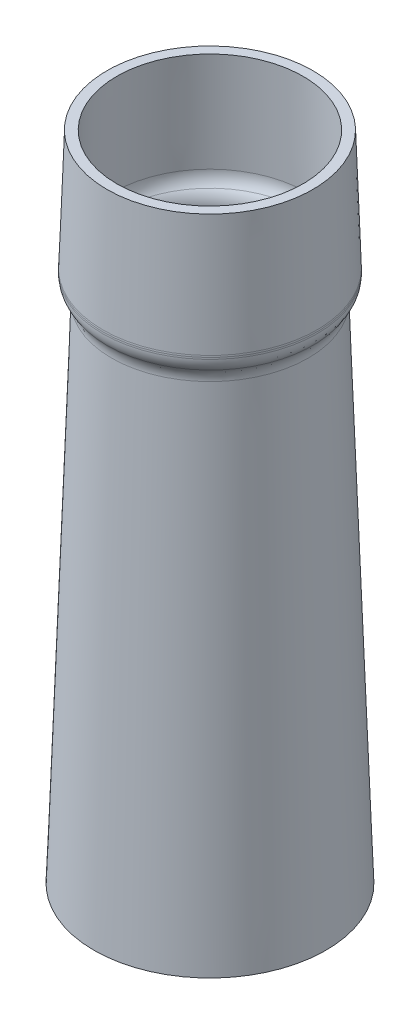
ISO-10303-21;
HEADER;
FILE_DESCRIPTION(('STEP AP214'),'2;1');
FILE_NAME('part.step','',(''),(''),'','','');
FILE_SCHEMA(('AUTOMOTIVE_DESIGN { 1 0 10303 214 1 1 1 1 }'));
ENDSEC;
DATA;
#1=APPLICATION_CONTEXT('core data for automotive mechanical design processes');
#2=APPLICATION_PROTOCOL_DEFINITION('international standard','automotive_design',2000,#1);
#3=PRODUCT_CONTEXT('',#1,'mechanical');
#4=PRODUCT('Part','Part','',(#3));
#5=PRODUCT_RELATED_PRODUCT_CATEGORY('part','',(#4));
#6=PRODUCT_DEFINITION_FORMATION('','',#4);
#7=PRODUCT_DEFINITION_CONTEXT('part definition',#1,'design');
#8=PRODUCT_DEFINITION('design','',#6,#7);
#9=PRODUCT_DEFINITION_SHAPE('','',#8);
#10=(LENGTH_UNIT() NAMED_UNIT(*) SI_UNIT(.MILLI.,.METRE.));
#11=(NAMED_UNIT(*) PLANE_ANGLE_UNIT() SI_UNIT($,.RADIAN.));
#12=(NAMED_UNIT(*) SI_UNIT($,.STERADIAN.) SOLID_ANGLE_UNIT());
#13=UNCERTAINTY_MEASURE_WITH_UNIT(LENGTH_MEASURE(1.E-05),#10,'distance_accuracy_value','');
#14=(GEOMETRIC_REPRESENTATION_CONTEXT(3) GLOBAL_UNCERTAINTY_ASSIGNED_CONTEXT((#13)) GLOBAL_UNIT_ASSIGNED_CONTEXT((#10,
#11,#12)) REPRESENTATION_CONTEXT('',''));
#15=CARTESIAN_POINT('',(0.,0.,0.));
#16=DIRECTION('',(0.,0.,1.));
#17=DIRECTION('',(1.,0.,0.));
#18=AXIS2_PLACEMENT_3D('',#15,#16,#17);
#19=CARTESIAN_POINT('',(0.,-6.7,0.));
#20=DIRECTION('',(0.,1.,0.));
#21=DIRECTION('',(0.,0.,1.));
#22=AXIS2_PLACEMENT_3D('',#19,#20,#21);
#23=CYLINDRICAL_SURFACE('',#22,5.47150877);
#24=CARTESIAN_POINT('',(0.,-6.26970812050673,0.));
#25=DIRECTION('',(0.,-1.,0.));
#26=DIRECTION('',(0.,0.,-1.));
#27=AXIS2_PLACEMENT_3D('',#24,#25,#26);
#28=CIRCLE('',#27,5.47150877);
#29=CARTESIAN_POINT('',(0.,-6.26970812050673,-5.47150877));
#30=VERTEX_POINT('',#29);
#31=EDGE_CURVE('E48',#30,#30,#28,.F.);
#32=ORIENTED_EDGE('',*,*,#31,.T.);
#33=EDGE_LOOP('',(#32));
#34=FACE_BOUND('',#33,.T.);
#35=CARTESIAN_POINT('',(0.,-6.18349825924491,0.));
#36=DIRECTION('',(0.,1.,0.));
#37=DIRECTION('',(0.,0.,1.));
#38=AXIS2_PLACEMENT_3D('',#35,#36,#37);
#39=CIRCLE('',#38,5.47150877);
#40=CARTESIAN_POINT('',(0.,-6.18349825924491,5.47150877));
#41=VERTEX_POINT('',#40);
#42=EDGE_CURVE('E53',#41,#41,#39,.F.);
#43=ORIENTED_EDGE('',*,*,#42,.T.);
#44=EDGE_LOOP('',(#43));
#45=FACE_BOUND('',#44,.T.);
#46=ADVANCED_FACE('F40',(#34,#45),#23,.T.);
#47=CARTESIAN_POINT('',(0.,0.,0.));
#48=DIRECTION('',(0.,-1.,0.));
#49=DIRECTION('',(0.,0.,1.));
#50=AXIS2_PLACEMENT_3D('',#47,#48,#49);
#51=CONICAL_SURFACE('',#50,4.255,0.0349065850398866);
#52=CARTESIAN_POINT('',(0.,-33.3,0.));
#53=DIRECTION('',(0.,1.,0.));
#54=DIRECTION('',(0.,0.,1.));
#55=AXIS2_PLACEMENT_3D('',#52,#53,#54);
#56=CIRCLE('',#55,5.4178616240752);
#57=CARTESIAN_POINT('',(0.,-33.3,5.4178616240752));
#58=VERTEX_POINT('',#57);
#59=EDGE_CURVE('E81',#58,#58,#56,.T.);
#60=ORIENTED_EDGE('',*,*,#59,.F.);
#61=EDGE_LOOP('',(#60));
#62=FACE_BOUND('',#61,.T.);
#63=CARTESIAN_POINT('',(0.,-6.7,0.));
#64=DIRECTION('',(0.,1.,0.));
#65=DIRECTION('',(0.,0.,1.));
#66=AXIS2_PLACEMENT_3D('',#63,#64,#65);
#67=CIRCLE('',#66,4.48896915559471);
#68=CARTESIAN_POINT('',(0.,-6.7,4.48896915559471));
#69=VERTEX_POINT('',#68);
#70=EDGE_CURVE('E76',#69,#69,#67,.F.);
#71=ORIENTED_EDGE('',*,*,#70,.F.);
#72=EDGE_LOOP('',(#71));
#73=FACE_BOUND('',#72,.T.);
#74=ADVANCED_FACE('F120',(#62,#73),#51,.F.);
#75=CARTESIAN_POINT('',(0.,0.,0.));
#76=DIRECTION('',(0.,-1.,0.));
#77=DIRECTION('',(0.,0.,1.));
#78=AXIS2_PLACEMENT_3D('',#75,#76,#77);
#79=CONICAL_SURFACE('',#78,4.755,0.0349065850398866);
#80=CARTESIAN_POINT('',(0.,-7.57183830344286,0.));
#81=DIRECTION('',(0.,-1.,0.));
#82=DIRECTION('',(0.,0.,-1.));
#83=AXIS2_PLACEMENT_3D('',#80,#81,#82);
#84=CIRCLE('',#83,5.01941442002331);
#85=CARTESIAN_POINT('',(0.,-7.57183830344286,-5.01941442002331));
#86=VERTEX_POINT('',#85);
#87=EDGE_CURVE('E58',#86,#86,#84,.T.);
#88=ORIENTED_EDGE('',*,*,#87,.T.);
#89=EDGE_LOOP('',(#88));
#90=FACE_BOUND('',#89,.T.);
#91=CARTESIAN_POINT('',(0.,-33.3,0.));
#92=DIRECTION('',(0.,1.,0.));
#93=DIRECTION('',(0.,0.,1.));
#94=AXIS2_PLACEMENT_3D('',#91,#92,#93);
#95=CIRCLE('',#94,5.9178616240752);
#96=CARTESIAN_POINT('',(0.,-33.3,5.9178616240752));
#97=VERTEX_POINT('',#96);
#98=EDGE_CURVE('E83',#97,#97,#95,.T.);
#99=ORIENTED_EDGE('',*,*,#98,.T.);
#100=EDGE_LOOP('',(#99));
#101=FACE_BOUND('',#100,.T.);
#102=ADVANCED_FACE('F115',(#90,#101),#79,.T.);
#103=CARTESIAN_POINT('',(0.,-33.3,0.));
#104=DIRECTION('',(0.,1.,0.));
#105=DIRECTION('',(0.,0.,1.));
#106=AXIS2_PLACEMENT_3D('',#103,#104,#105);
#107=PLANE('',#106);
#108=ORIENTED_EDGE('',*,*,#59,.T.);
#109=EDGE_LOOP('',(#108));
#110=FACE_BOUND('',#109,.T.);
#111=ORIENTED_EDGE('',*,*,#98,.F.);
#112=EDGE_LOOP('',(#111));
#113=FACE_BOUND('',#112,.T.);
#114=ADVANCED_FACE('F105',(#110,#113),#107,.F.);
#115=CARTESIAN_POINT('',(0.,-6.2,0.));
#116=DIRECTION('',(0.,-1.,0.));
#117=DIRECTION('',(0.,0.,1.));
#118=AXIS2_PLACEMENT_3D('',#115,#116,#117);
#119=CONICAL_SURFACE('',#118,5.47150877,0.0349065850398866);
#120=CARTESIAN_POINT('',(0.,-6.1,0.));
#121=DIRECTION('',(0.,1.,0.));
#122=DIRECTION('',(0.,0.,1.));
#123=AXIS2_PLACEMENT_3D('',#120,#121,#122);
#124=CIRCLE('',#123,5.46801669305083);
#125=CARTESIAN_POINT('',(0.,-6.1,5.46801669305083));
#126=VERTEX_POINT('',#125);
#127=EDGE_CURVE('E77',#126,#126,#124,.F.);
#128=ORIENTED_EDGE('',*,*,#127,.F.);
#129=EDGE_LOOP('',(#128));
#130=FACE_BOUND('',#129,.T.);
#131=CARTESIAN_POINT('',(0.,0.,0.));
#132=DIRECTION('',(0.,1.,0.));
#133=DIRECTION('',(0.,0.,1.));
#134=AXIS2_PLACEMENT_3D('',#131,#132,#133);
#135=CIRCLE('',#134,5.25499999915116);
#136=CARTESIAN_POINT('',(0.,0.,5.25499999915116));
#137=VERTEX_POINT('',#136);
#138=EDGE_CURVE('E96',#137,#137,#135,.T.);
#139=ORIENTED_EDGE('',*,*,#138,.F.);
#140=EDGE_LOOP('',(#139));
#141=FACE_BOUND('',#140,.T.);
#142=ADVANCED_FACE('F103',(#130,#141),#119,.T.);
#143=CARTESIAN_POINT('',(0.,0.,0.));
#144=DIRECTION('',(0.,1.,0.));
#145=DIRECTION('',(0.,0.,1.));
#146=AXIS2_PLACEMENT_3D('',#143,#144,#145);
#147=PLANE('',#146);
#148=CARTESIAN_POINT('',(0.,0.,0.));
#149=DIRECTION('',(0.,1.,0.));
#150=DIRECTION('',(0.,0.,1.));
#151=AXIS2_PLACEMENT_3D('',#148,#149,#150);
#152=CIRCLE('',#151,4.755);
#153=CARTESIAN_POINT('',(0.,0.,4.755));
#154=VERTEX_POINT('',#153);
#155=EDGE_CURVE('E82',#154,#154,#152,.T.);
#156=ORIENTED_EDGE('',*,*,#155,.F.);
#157=EDGE_LOOP('',(#156));
#158=FACE_BOUND('',#157,.T.);
#159=ORIENTED_EDGE('',*,*,#138,.T.);
#160=EDGE_LOOP('',(#159));
#161=FACE_BOUND('',#160,.T.);
#162=ADVANCED_FACE('F101',(#158,#161),#147,.T.);
#163=CARTESIAN_POINT('',(0.,0.,0.));
#164=DIRECTION('',(0.,-1.,0.));
#165=DIRECTION('',(0.,0.,1.));
#166=AXIS2_PLACEMENT_3D('',#163,#164,#165);
#167=CONICAL_SURFACE('',#166,4.755,0.0349065850398866);
#168=CARTESIAN_POINT('',(0.,-5.219385381842,0.));
#169=DIRECTION('',(0.,1.,0.));
#170=DIRECTION('',(0.,0.,1.));
#171=AXIS2_PLACEMENT_3D('',#168,#169,#170);
#172=CIRCLE('',#171,4.9372649538079);
#173=CARTESIAN_POINT('',(0.,-5.219385381842,4.9372649538079));
#174=VERTEX_POINT('',#173);
#175=EDGE_CURVE('E68',#174,#174,#172,.F.);
#176=ORIENTED_EDGE('',*,*,#175,.T.);
#177=EDGE_LOOP('',(#176));
#178=FACE_BOUND('',#177,.T.);
#179=ORIENTED_EDGE('',*,*,#155,.T.);
#180=EDGE_LOOP('',(#179));
#181=FACE_BOUND('',#180,.T.);
#182=ADVANCED_FACE('F112',(#178,#181),#167,.F.);
#183=CARTESIAN_POINT('',(0.,-6.51394650109102,0.));
#184=DIRECTION('',(0.,-1.,0.));
#185=DIRECTION('',(0.,0.,-1.));
#186=AXIS2_PLACEMENT_3D('',#183,#184,#185);
#187=TOROIDAL_SURFACE('',#186,5.47150877084884,1.);
#188=CARTESIAN_POINT('',(0.,-6.51394650109102,0.));
#189=DIRECTION('',(0.,-1.,0.));
#190=DIRECTION('',(0.,0.,-1.));
#191=AXIS2_PLACEMENT_3D('',#188,#189,#190);
#192=CIRCLE('',#191,4.47150877084884);
#193=CARTESIAN_POINT('',(0.,-6.51394650109102,-4.47150877084884));
#194=VERTEX_POINT('',#193);
#195=EDGE_CURVE('E72',#194,#194,#192,.T.);
#196=ORIENTED_EDGE('',*,*,#195,.F.);
#197=EDGE_LOOP('',(#196));
#198=FACE_BOUND('',#197,.T.);
#199=ORIENTED_EDGE('',*,*,#70,.T.);
#200=EDGE_LOOP('',(#199));
#201=FACE_BOUND('',#200,.T.);
#202=ADVANCED_FACE('F133',(#198,#201),#187,.T.);
#203=CARTESIAN_POINT('',(0.,-5.25428487854451,0.));
#204=DIRECTION('',(0.,-1.,0.));
#205=DIRECTION('',(0.,0.,-1.));
#206=AXIS2_PLACEMENT_3D('',#203,#204,#205);
#207=TOROIDAL_SURFACE('',#206,3.93787412678881,1.);
#208=CARTESIAN_POINT('',(0.,-5.89632845223577,0.));
#209=DIRECTION('',(0.,1.,0.));
#210=DIRECTION('',(0.,0.,1.));
#211=AXIS2_PLACEMENT_3D('',#208,#209,#210);
#212=CIRCLE('',#211,4.70454227500012);
#213=CARTESIAN_POINT('',(0.,-5.89632845223577,4.70454227500012));
#214=VERTEX_POINT('',#213);
#215=EDGE_CURVE('E64',#214,#214,#212,.F.);
#216=ORIENTED_EDGE('',*,*,#215,.T.);
#217=EDGE_LOOP('',(#216));
#218=FACE_BOUND('',#217,.T.);
#219=ORIENTED_EDGE('',*,*,#175,.F.);
#220=EDGE_LOOP('',(#219));
#221=FACE_BOUND('',#220,.T.);
#222=ADVANCED_FACE('F136',(#218,#221),#207,.F.);
#223=CARTESIAN_POINT('',(0.,-6.53837202592703,0.));
#224=DIRECTION('',(0.,1.,0.));
#225=DIRECTION('',(0.,0.,1.));
#226=AXIS2_PLACEMENT_3D('',#223,#224,#225);
#227=TOROIDAL_SURFACE('',#226,5.47121042321143,1.);
#228=ORIENTED_EDGE('',*,*,#215,.F.);
#229=EDGE_LOOP('',(#228));
#230=FACE_BOUND('',#229,.T.);
#231=ORIENTED_EDGE('',*,*,#195,.T.);
#232=EDGE_LOOP('',(#231));
#233=FACE_BOUND('',#232,.T.);
#234=ADVANCED_FACE('F140',(#230,#233),#227,.T.);
#235=CARTESIAN_POINT('',(0.,-7.53693880674036,0.));
#236=DIRECTION('',(0.,1.,0.));
#237=DIRECTION('',(0.,0.,1.));
#238=AXIS2_PLACEMENT_3D('',#235,#236,#237);
#239=TOROIDAL_SURFACE('',#238,6.01880524704241,1.);
#240=CARTESIAN_POINT('',(0.,-6.90332346362355,0.));
#241=DIRECTION('',(0.,-1.,0.));
#242=DIRECTION('',(0.,0.,-1.));
#243=AXIS2_PLACEMENT_3D('',#240,#241,#242);
#244=CIRCLE('',#243,5.24515700852121);
#245=CARTESIAN_POINT('',(0.,-6.90332346362355,-5.24515700852121));
#246=VERTEX_POINT('',#245);
#247=EDGE_CURVE('E10',#246,#246,#244,.T.);
#248=ORIENTED_EDGE('',*,*,#247,.T.);
#249=EDGE_LOOP('',(#248));
#250=FACE_BOUND('',#249,.T.);
#251=ORIENTED_EDGE('',*,*,#87,.F.);
#252=EDGE_LOOP('',(#251));
#253=FACE_BOUND('',#252,.T.);
#254=ADVANCED_FACE('F144',(#250,#253),#239,.F.);
#255=CARTESIAN_POINT('',(0.,-6.26970812050673,0.));
#256=DIRECTION('',(0.,-1.,0.));
#257=DIRECTION('',(0.,0.,-1.));
#258=AXIS2_PLACEMENT_3D('',#255,#256,#257);
#259=TOROIDAL_SURFACE('',#258,4.47150877,1.);
#260=ORIENTED_EDGE('',*,*,#247,.F.);
#261=EDGE_LOOP('',(#260));
#262=FACE_BOUND('',#261,.T.);
#263=ORIENTED_EDGE('',*,*,#31,.F.);
#264=EDGE_LOOP('',(#263));
#265=FACE_BOUND('',#264,.T.);
#266=ADVANCED_FACE('F147',(#262,#265),#259,.T.);
#267=CARTESIAN_POINT('',(0.,-6.18349825924491,0.));
#268=DIRECTION('',(0.,1.,0.));
#269=DIRECTION('',(0.,0.,1.));
#270=AXIS2_PLACEMENT_3D('',#267,#268,#269);
#271=TOROIDAL_SURFACE('',#270,4.47150877,1.);
#272=ORIENTED_EDGE('',*,*,#42,.F.);
#273=EDGE_LOOP('',(#272));
#274=FACE_BOUND('',#273,.T.);
#275=ORIENTED_EDGE('',*,*,#127,.T.);
#276=EDGE_LOOP('',(#275));
#277=FACE_BOUND('',#276,.T.);
#278=ADVANCED_FACE('F42',(#274,#277),#271,.T.);
#279=CLOSED_SHELL('',(#46,#74,#102,#114,#142,#162,#182,#202,#222,#234,#254,#266,#278));
#280=MANIFOLD_SOLID_BREP('B2',#279);
#281=ADVANCED_BREP_SHAPE_REPRESENTATION('',(#18,#280),#14);
#282=SHAPE_DEFINITION_REPRESENTATION(#9,#281);
ENDSEC;
END-ISO-10303-21;
